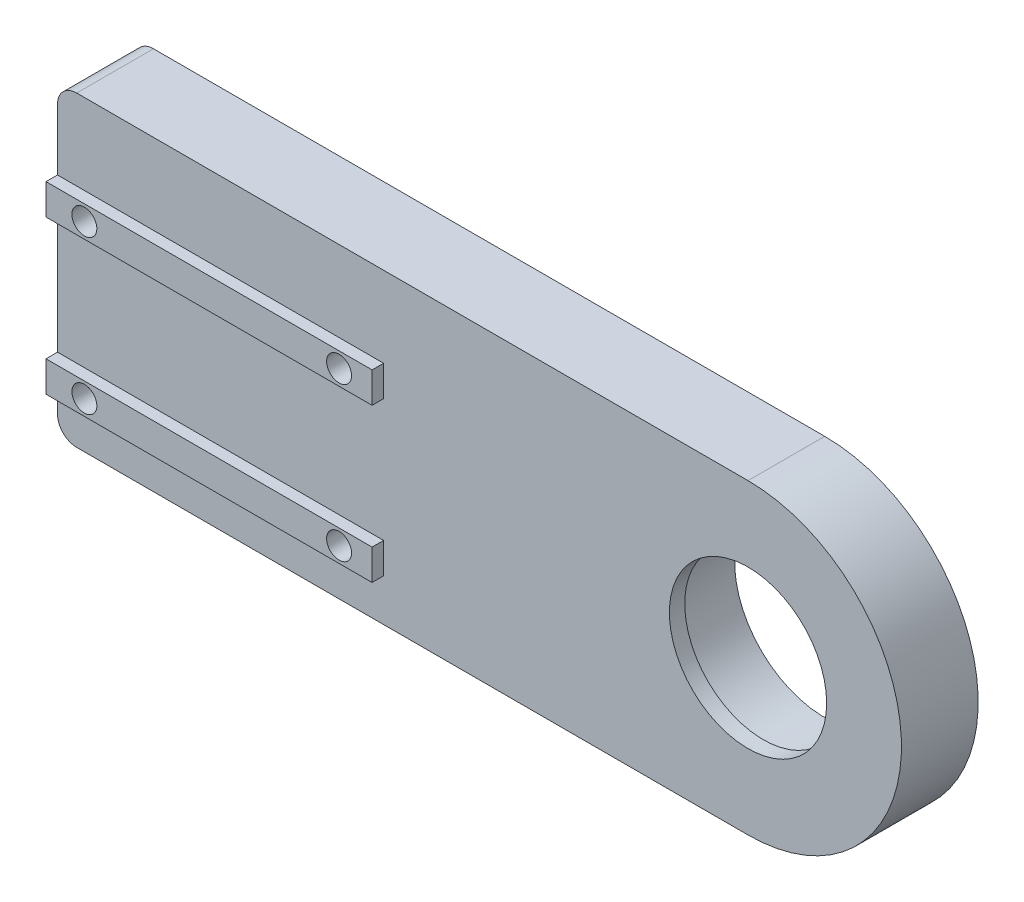
ISO-10303-21;
HEADER;
FILE_DESCRIPTION(('STEP AP214'),'2;1');
FILE_NAME('part.step','',(''),(''),'','','');
FILE_SCHEMA(('AUTOMOTIVE_DESIGN { 1 0 10303 214 1 1 1 1 }'));
ENDSEC;
DATA;
#1=APPLICATION_CONTEXT('core data for automotive mechanical design processes');
#2=APPLICATION_PROTOCOL_DEFINITION('international standard','automotive_design',2000,#1);
#3=PRODUCT_CONTEXT('',#1,'mechanical');
#4=PRODUCT('Part','Part','',(#3));
#5=PRODUCT_RELATED_PRODUCT_CATEGORY('part','',(#4));
#6=PRODUCT_DEFINITION_FORMATION('','',#4);
#7=PRODUCT_DEFINITION_CONTEXT('part definition',#1,'design');
#8=PRODUCT_DEFINITION('design','',#6,#7);
#9=PRODUCT_DEFINITION_SHAPE('','',#8);
#10=(LENGTH_UNIT() NAMED_UNIT(*) SI_UNIT(.MILLI.,.METRE.));
#11=(NAMED_UNIT(*) PLANE_ANGLE_UNIT() SI_UNIT($,.RADIAN.));
#12=(NAMED_UNIT(*) SI_UNIT($,.STERADIAN.) SOLID_ANGLE_UNIT());
#13=UNCERTAINTY_MEASURE_WITH_UNIT(LENGTH_MEASURE(1.E-05),#10,'distance_accuracy_value','');
#14=(GEOMETRIC_REPRESENTATION_CONTEXT(3) GLOBAL_UNCERTAINTY_ASSIGNED_CONTEXT((#13)) GLOBAL_UNIT_ASSIGNED_CONTEXT((#10,
#11,#12)) REPRESENTATION_CONTEXT('',''));
#15=CARTESIAN_POINT('',(0.,0.,0.));
#16=DIRECTION('',(0.,0.,1.));
#17=DIRECTION('',(1.,0.,0.));
#18=AXIS2_PLACEMENT_3D('',#15,#16,#17);
#19=CARTESIAN_POINT('',(-103.6,15.,3.));
#20=DIRECTION('',(0.,0.,-1.));
#21=DIRECTION('',(1.,0.,0.));
#22=AXIS2_PLACEMENT_3D('',#19,#20,#21);
#23=CYLINDRICAL_SURFACE('',#22,3.25000000000001);
#24=CARTESIAN_POINT('',(-103.6,15.,3.));
#25=DIRECTION('',(0.,0.,1.));
#26=DIRECTION('',(1.,0.,0.));
#27=AXIS2_PLACEMENT_3D('',#24,#25,#26);
#28=CIRCLE('',#27,3.25000000000001);
#29=CARTESIAN_POINT('',(-100.35,15.,3.));
#30=VERTEX_POINT('',#29);
#31=EDGE_CURVE('E170',#30,#30,#28,.T.);
#32=ORIENTED_EDGE('',*,*,#31,.T.);
#33=EDGE_LOOP('',(#32));
#34=FACE_BOUND('',#33,.T.);
#35=CARTESIAN_POINT('',(-103.6,15.,-15.5));
#36=DIRECTION('',(0.,0.,1.));
#37=DIRECTION('',(1.,0.,0.));
#38=AXIS2_PLACEMENT_3D('',#35,#36,#37);
#39=CIRCLE('',#38,3.25000000000001);
#40=CARTESIAN_POINT('',(-100.35,15.,-15.5));
#41=VERTEX_POINT('',#40);
#42=EDGE_CURVE('E260',#41,#41,#39,.F.);
#43=ORIENTED_EDGE('',*,*,#42,.T.);
#44=EDGE_LOOP('',(#43));
#45=FACE_BOUND('',#44,.T.);
#46=ADVANCED_FACE('F37',(#34,#45),#23,.F.);
#47=CARTESIAN_POINT('',(-170.,15.,3.));
#48=DIRECTION('',(0.,0.,-1.));
#49=DIRECTION('',(1.,0.,0.));
#50=AXIS2_PLACEMENT_3D('',#47,#48,#49);
#51=CYLINDRICAL_SURFACE('',#50,3.25000000000001);
#52=CARTESIAN_POINT('',(-170.,15.,3.));
#53=DIRECTION('',(0.,0.,1.));
#54=DIRECTION('',(1.,0.,0.));
#55=AXIS2_PLACEMENT_3D('',#52,#53,#54);
#56=CIRCLE('',#55,3.25000000000001);
#57=CARTESIAN_POINT('',(-166.75,15.,3.));
#58=VERTEX_POINT('',#57);
#59=EDGE_CURVE('E432',#58,#58,#56,.T.);
#60=ORIENTED_EDGE('',*,*,#59,.T.);
#61=EDGE_LOOP('',(#60));
#62=FACE_BOUND('',#61,.T.);
#63=CARTESIAN_POINT('',(-170.,15.,-15.5));
#64=DIRECTION('',(0.,0.,1.));
#65=DIRECTION('',(1.,0.,0.));
#66=AXIS2_PLACEMENT_3D('',#63,#64,#65);
#67=CIRCLE('',#66,3.25000000000001);
#68=CARTESIAN_POINT('',(-166.75,15.,-15.5));
#69=VERTEX_POINT('',#68);
#70=EDGE_CURVE('E257',#69,#69,#67,.F.);
#71=ORIENTED_EDGE('',*,*,#70,.T.);
#72=EDGE_LOOP('',(#71));
#73=FACE_BOUND('',#72,.T.);
#74=ADVANCED_FACE('F306',(#62,#73),#51,.F.);
#75=CARTESIAN_POINT('',(-170.,-25.,3.));
#76=DIRECTION('',(0.,0.,-1.));
#77=DIRECTION('',(1.,0.,0.));
#78=AXIS2_PLACEMENT_3D('',#75,#76,#77);
#79=CYLINDRICAL_SURFACE('',#78,3.25000000000001);
#80=CARTESIAN_POINT('',(-170.,-25.,3.));
#81=DIRECTION('',(0.,0.,1.));
#82=DIRECTION('',(1.,0.,0.));
#83=AXIS2_PLACEMENT_3D('',#80,#81,#82);
#84=CIRCLE('',#83,3.25000000000001);
#85=CARTESIAN_POINT('',(-166.75,-25.,3.));
#86=VERTEX_POINT('',#85);
#87=EDGE_CURVE('E435',#86,#86,#84,.T.);
#88=ORIENTED_EDGE('',*,*,#87,.T.);
#89=EDGE_LOOP('',(#88));
#90=FACE_BOUND('',#89,.T.);
#91=CARTESIAN_POINT('',(-170.,-25.,-15.5));
#92=DIRECTION('',(0.,0.,1.));
#93=DIRECTION('',(1.,0.,0.));
#94=AXIS2_PLACEMENT_3D('',#91,#92,#93);
#95=CIRCLE('',#94,3.25000000000001);
#96=CARTESIAN_POINT('',(-166.75,-25.,-15.5));
#97=VERTEX_POINT('',#96);
#98=EDGE_CURVE('E253',#97,#97,#95,.F.);
#99=ORIENTED_EDGE('',*,*,#98,.T.);
#100=EDGE_LOOP('',(#99));
#101=FACE_BOUND('',#100,.T.);
#102=ADVANCED_FACE('F312',(#90,#101),#79,.F.);
#103=CARTESIAN_POINT('',(-103.6,-25.,3.));
#104=DIRECTION('',(0.,0.,-1.));
#105=DIRECTION('',(1.,0.,0.));
#106=AXIS2_PLACEMENT_3D('',#103,#104,#105);
#107=CYLINDRICAL_SURFACE('',#106,3.25000000000001);
#108=CARTESIAN_POINT('',(-103.6,-25.,3.));
#109=DIRECTION('',(0.,0.,1.));
#110=DIRECTION('',(1.,0.,0.));
#111=AXIS2_PLACEMENT_3D('',#108,#109,#110);
#112=CIRCLE('',#111,3.25000000000001);
#113=CARTESIAN_POINT('',(-100.35,-25.,3.));
#114=VERTEX_POINT('',#113);
#115=EDGE_CURVE('E263',#114,#114,#112,.T.);
#116=ORIENTED_EDGE('',*,*,#115,.T.);
#117=EDGE_LOOP('',(#116));
#118=FACE_BOUND('',#117,.T.);
#119=CARTESIAN_POINT('',(-103.6,-25.,-15.5));
#120=DIRECTION('',(0.,0.,1.));
#121=DIRECTION('',(1.,0.,0.));
#122=AXIS2_PLACEMENT_3D('',#119,#120,#121);
#123=CIRCLE('',#122,3.25000000000001);
#124=CARTESIAN_POINT('',(-100.35,-25.,-15.5));
#125=VERTEX_POINT('',#124);
#126=EDGE_CURVE('E250',#125,#125,#123,.F.);
#127=ORIENTED_EDGE('',*,*,#126,.T.);
#128=EDGE_LOOP('',(#127));
#129=FACE_BOUND('',#128,.T.);
#130=ADVANCED_FACE('F319',(#118,#129),#107,.F.);
#131=CARTESIAN_POINT('',(0.,0.,0.));
#132=DIRECTION('',(0.,0.,-1.));
#133=DIRECTION('',(1.,0.,0.));
#134=AXIS2_PLACEMENT_3D('',#131,#132,#133);
#135=PLANE('',#134);
#136=CARTESIAN_POINT('',(0.,0.,0.));
#137=DIRECTION('',(0.,0.,1.));
#138=DIRECTION('',(1.,0.,0.));
#139=AXIS2_PLACEMENT_3D('',#136,#137,#138);
#140=CIRCLE('',#139,20.5);
#141=CARTESIAN_POINT('',(20.5,0.,0.));
#142=VERTEX_POINT('',#141);
#143=EDGE_CURVE('E217',#142,#142,#140,.T.);
#144=ORIENTED_EDGE('',*,*,#143,.F.);
#145=EDGE_LOOP('',(#144));
#146=FACE_BOUND('',#145,.T.);
#147=DIRECTION('',(0.,-1.,0.));
#148=VECTOR('',#147,1.);
#149=CARTESIAN_POINT('',(-180.,40.,0.));
#150=LINE('',#149,#148);
#151=CARTESIAN_POINT('',(-180.,35.,0.));
#152=VERTEX_POINT('',#151);
#153=CARTESIAN_POINT('',(-180.,19.,0.));
#154=VERTEX_POINT('',#153);
#155=EDGE_CURVE('E239',#152,#154,#150,.T.);
#156=ORIENTED_EDGE('',*,*,#155,.T.);
#157=DIRECTION('',(1.,0.,0.));
#158=VECTOR('',#157,1.);
#159=CARTESIAN_POINT('',(-180.,19.,0.));
#160=LINE('',#159,#158);
#161=CARTESIAN_POINT('',(-95.,19.,0.));
#162=VERTEX_POINT('',#161);
#163=EDGE_CURVE('E153',#154,#162,#160,.T.);
#164=ORIENTED_EDGE('',*,*,#163,.T.);
#165=DIRECTION('',(0.,-1.,0.));
#166=VECTOR('',#165,1.);
#167=CARTESIAN_POINT('',(-95.,11.,0.));
#168=LINE('',#167,#166);
#169=CARTESIAN_POINT('',(-95.,11.,0.));
#170=VERTEX_POINT('',#169);
#171=EDGE_CURVE('E167',#162,#170,#168,.T.);
#172=ORIENTED_EDGE('',*,*,#171,.T.);
#173=DIRECTION('',(-1.,0.,0.));
#174=VECTOR('',#173,1.);
#175=CARTESIAN_POINT('',(-180.,11.,0.));
#176=LINE('',#175,#174);
#177=CARTESIAN_POINT('',(-180.,11.,0.));
#178=VERTEX_POINT('',#177);
#179=EDGE_CURVE('E164',#170,#178,#176,.T.);
#180=ORIENTED_EDGE('',*,*,#179,.T.);
#181=CARTESIAN_POINT('',(-180.,-21.,0.));
#182=VERTEX_POINT('',#181);
#183=EDGE_CURVE('E241',#178,#182,#150,.T.);
#184=ORIENTED_EDGE('',*,*,#183,.T.);
#185=DIRECTION('',(1.,0.,0.));
#186=VECTOR('',#185,1.);
#187=CARTESIAN_POINT('',(-180.,-21.,0.));
#188=LINE('',#187,#186);
#189=CARTESIAN_POINT('',(-95.,-21.,0.));
#190=VERTEX_POINT('',#189);
#191=EDGE_CURVE('E157',#182,#190,#188,.T.);
#192=ORIENTED_EDGE('',*,*,#191,.T.);
#193=DIRECTION('',(0.,-1.,0.));
#194=VECTOR('',#193,1.);
#195=CARTESIAN_POINT('',(-95.,-29.,0.));
#196=LINE('',#195,#194);
#197=CARTESIAN_POINT('',(-95.,-29.,0.));
#198=VERTEX_POINT('',#197);
#199=EDGE_CURVE('E198',#190,#198,#196,.T.);
#200=ORIENTED_EDGE('',*,*,#199,.T.);
#201=DIRECTION('',(-1.,0.,0.));
#202=VECTOR('',#201,1.);
#203=CARTESIAN_POINT('',(-180.,-29.,0.));
#204=LINE('',#203,#202);
#205=CARTESIAN_POINT('',(-180.,-29.,0.));
#206=VERTEX_POINT('',#205);
#207=EDGE_CURVE('E187',#198,#206,#204,.T.);
#208=ORIENTED_EDGE('',*,*,#207,.T.);
#209=CARTESIAN_POINT('',(-180.,-35.,0.));
#210=VERTEX_POINT('',#209);
#211=EDGE_CURVE('E238',#206,#210,#150,.T.);
#212=ORIENTED_EDGE('',*,*,#211,.T.);
#213=CARTESIAN_POINT('',(-175.,-35.,0.));
#214=DIRECTION('',(0.,0.,1.));
#215=DIRECTION('',(1.,0.,0.));
#216=AXIS2_PLACEMENT_3D('',#213,#214,#215);
#217=CIRCLE('',#216,5.);
#218=CARTESIAN_POINT('',(-175.,-40.,0.));
#219=VERTEX_POINT('',#218);
#220=EDGE_CURVE('E267',#219,#210,#217,.F.);
#221=ORIENTED_EDGE('',*,*,#220,.F.);
#222=DIRECTION('',(1.,0.,0.));
#223=VECTOR('',#222,1.);
#224=CARTESIAN_POINT('',(-180.,-40.,0.));
#225=LINE('',#224,#223);
#226=CARTESIAN_POINT('',(0.,-40.,0.));
#227=VERTEX_POINT('',#226);
#228=EDGE_CURVE('E225',#219,#227,#225,.T.);
#229=ORIENTED_EDGE('',*,*,#228,.T.);
#230=CARTESIAN_POINT('',(0.,0.,0.));
#231=DIRECTION('',(0.,0.,1.));
#232=DIRECTION('',(1.,0.,0.));
#233=AXIS2_PLACEMENT_3D('',#230,#231,#232);
#234=CIRCLE('',#233,40.);
#235=CARTESIAN_POINT('',(0.,40.,0.));
#236=VERTEX_POINT('',#235);
#237=EDGE_CURVE('E220',#227,#236,#234,.T.);
#238=ORIENTED_EDGE('',*,*,#237,.T.);
#239=DIRECTION('',(-1.,0.,0.));
#240=VECTOR('',#239,1.);
#241=CARTESIAN_POINT('',(0.,40.,0.));
#242=LINE('',#241,#240);
#243=CARTESIAN_POINT('',(-175.,40.,0.));
#244=VERTEX_POINT('',#243);
#245=EDGE_CURVE('E235',#236,#244,#242,.T.);
#246=ORIENTED_EDGE('',*,*,#245,.T.);
#247=CARTESIAN_POINT('',(-175.,35.,0.));
#248=DIRECTION('',(0.,0.,1.));
#249=DIRECTION('',(1.,0.,0.));
#250=AXIS2_PLACEMENT_3D('',#247,#248,#249);
#251=CIRCLE('',#250,5.);
#252=EDGE_CURVE('E270',#152,#244,#251,.F.);
#253=ORIENTED_EDGE('',*,*,#252,.F.);
#254=EDGE_LOOP('',(#156,#164,#172,#180,#184,#192,#200,#208,#212,#221,#229,#238,#246,#253));
#255=FACE_BOUND('',#254,.T.);
#256=ADVANCED_FACE('F284',(#146,#255),#135,.F.);
#257=CARTESIAN_POINT('',(0.,0.,-20.));
#258=DIRECTION('',(0.,0.,1.));
#259=DIRECTION('',(-1.,0.,0.));
#260=AXIS2_PLACEMENT_3D('',#257,#258,#259);
#261=CYLINDRICAL_SURFACE('',#260,20.5);
#262=ORIENTED_EDGE('',*,*,#143,.T.);
#263=EDGE_LOOP('',(#262));
#264=FACE_BOUND('',#263,.T.);
#265=CARTESIAN_POINT('',(0.,0.,-4.));
#266=DIRECTION('',(0.,0.,1.));
#267=DIRECTION('',(1.,0.,0.));
#268=AXIS2_PLACEMENT_3D('',#265,#266,#267);
#269=CIRCLE('',#268,20.5);
#270=CARTESIAN_POINT('',(20.5,0.,-4.));
#271=VERTEX_POINT('',#270);
#272=EDGE_CURVE('E214',#271,#271,#269,.T.);
#273=ORIENTED_EDGE('',*,*,#272,.F.);
#274=EDGE_LOOP('',(#273));
#275=FACE_BOUND('',#274,.T.);
#276=ADVANCED_FACE('F354',(#264,#275),#261,.F.);
#277=CARTESIAN_POINT('',(0.,0.,-20.));
#278=DIRECTION('',(0.,0.,-1.));
#279=DIRECTION('',(1.,0.,0.));
#280=AXIS2_PLACEMENT_3D('',#277,#278,#279);
#281=PLANE('',#280);
#282=CARTESIAN_POINT('',(-170.,-25.,-20.));
#283=DIRECTION('',(0.,0.,1.));
#284=DIRECTION('',(1.,0.,0.));
#285=AXIS2_PLACEMENT_3D('',#282,#283,#284);
#286=CIRCLE('',#285,5.50000000000002);
#287=CARTESIAN_POINT('',(-164.5,-25.,-20.));
#288=VERTEX_POINT('',#287);
#289=EDGE_CURVE('E659',#288,#288,#286,.T.);
#290=ORIENTED_EDGE('',*,*,#289,.T.);
#291=EDGE_LOOP('',(#290));
#292=FACE_BOUND('',#291,.T.);
#293=CARTESIAN_POINT('',(-103.6,-25.,-20.));
#294=DIRECTION('',(0.,0.,1.));
#295=DIRECTION('',(1.,0.,0.));
#296=AXIS2_PLACEMENT_3D('',#293,#294,#295);
#297=CIRCLE('',#296,5.49999999999999);
#298=CARTESIAN_POINT('',(-98.1,-25.,-20.));
#299=VERTEX_POINT('',#298);
#300=EDGE_CURVE('E652',#299,#299,#297,.T.);
#301=ORIENTED_EDGE('',*,*,#300,.T.);
#302=EDGE_LOOP('',(#301));
#303=FACE_BOUND('',#302,.T.);
#304=CARTESIAN_POINT('',(-103.6,15.,-20.));
#305=DIRECTION('',(0.,0.,1.));
#306=DIRECTION('',(1.,0.,0.));
#307=AXIS2_PLACEMENT_3D('',#304,#305,#306);
#308=CIRCLE('',#307,5.49999999999999);
#309=CARTESIAN_POINT('',(-98.1,15.,-20.));
#310=VERTEX_POINT('',#309);
#311=EDGE_CURVE('E428',#310,#310,#308,.T.);
#312=ORIENTED_EDGE('',*,*,#311,.T.);
#313=EDGE_LOOP('',(#312));
#314=FACE_BOUND('',#313,.T.);
#315=CARTESIAN_POINT('',(-170.,15.,-20.));
#316=DIRECTION('',(0.,0.,1.));
#317=DIRECTION('',(1.,0.,0.));
#318=AXIS2_PLACEMENT_3D('',#315,#316,#317);
#319=CIRCLE('',#318,5.50000000000002);
#320=CARTESIAN_POINT('',(-164.5,15.,-20.));
#321=VERTEX_POINT('',#320);
#322=EDGE_CURVE('E422',#321,#321,#319,.T.);
#323=ORIENTED_EDGE('',*,*,#322,.T.);
#324=EDGE_LOOP('',(#323));
#325=FACE_BOUND('',#324,.T.);
#326=CARTESIAN_POINT('',(0.,0.,-20.));
#327=DIRECTION('',(0.,0.,1.));
#328=DIRECTION('',(1.,0.,0.));
#329=AXIS2_PLACEMENT_3D('',#326,#327,#328);
#330=CIRCLE('',#329,23.5);
#331=CARTESIAN_POINT('',(23.5,0.,-20.));
#332=VERTEX_POINT('',#331);
#333=EDGE_CURVE('E210',#332,#332,#330,.T.);
#334=ORIENTED_EDGE('',*,*,#333,.T.);
#335=EDGE_LOOP('',(#334));
#336=FACE_BOUND('',#335,.T.);
#337=DIRECTION('',(-1.,0.,0.));
#338=VECTOR('',#337,1.);
#339=CARTESIAN_POINT('',(0.,40.,-20.));
#340=LINE('',#339,#338);
#341=CARTESIAN_POINT('',(0.,40.,-20.));
#342=VERTEX_POINT('',#341);
#343=CARTESIAN_POINT('',(-175.,40.,-20.));
#344=VERTEX_POINT('',#343);
#345=EDGE_CURVE('E224',#342,#344,#340,.T.);
#346=ORIENTED_EDGE('',*,*,#345,.F.);
#347=CARTESIAN_POINT('',(0.,0.,-20.));
#348=DIRECTION('',(0.,0.,1.));
#349=DIRECTION('',(1.,0.,0.));
#350=AXIS2_PLACEMENT_3D('',#347,#348,#349);
#351=CIRCLE('',#350,40.);
#352=CARTESIAN_POINT('',(0.,-40.,-20.));
#353=VERTEX_POINT('',#352);
#354=EDGE_CURVE('E221',#353,#342,#351,.T.);
#355=ORIENTED_EDGE('',*,*,#354,.F.);
#356=DIRECTION('',(1.,0.,0.));
#357=VECTOR('',#356,1.);
#358=CARTESIAN_POINT('',(-180.,-40.,-20.));
#359=LINE('',#358,#357);
#360=CARTESIAN_POINT('',(-175.,-40.,-20.));
#361=VERTEX_POINT('',#360);
#362=EDGE_CURVE('E230',#361,#353,#359,.T.);
#363=ORIENTED_EDGE('',*,*,#362,.F.);
#364=CARTESIAN_POINT('',(-175.,-35.,-20.));
#365=DIRECTION('',(0.,0.,1.));
#366=DIRECTION('',(1.,0.,0.));
#367=AXIS2_PLACEMENT_3D('',#364,#365,#366);
#368=CIRCLE('',#367,5.);
#369=CARTESIAN_POINT('',(-180.,-35.,-20.));
#370=VERTEX_POINT('',#369);
#371=EDGE_CURVE('E273',#370,#361,#368,.T.);
#372=ORIENTED_EDGE('',*,*,#371,.F.);
#373=DIRECTION('',(0.,-1.,0.));
#374=VECTOR('',#373,1.);
#375=CARTESIAN_POINT('',(-180.,40.,-20.));
#376=LINE('',#375,#374);
#377=CARTESIAN_POINT('',(-180.,35.,-20.));
#378=VERTEX_POINT('',#377);
#379=EDGE_CURVE('E228',#378,#370,#376,.T.);
#380=ORIENTED_EDGE('',*,*,#379,.F.);
#381=CARTESIAN_POINT('',(-175.,35.,-20.));
#382=DIRECTION('',(0.,0.,1.));
#383=DIRECTION('',(1.,0.,0.));
#384=AXIS2_PLACEMENT_3D('',#381,#382,#383);
#385=CIRCLE('',#384,5.);
#386=EDGE_CURVE('E45',#344,#378,#385,.T.);
#387=ORIENTED_EDGE('',*,*,#386,.F.);
#388=EDGE_LOOP('',(#346,#355,#363,#372,#380,#387));
#389=FACE_BOUND('',#388,.T.);
#390=ADVANCED_FACE('F280',(#292,#303,#314,#325,#336,#389),#281,.T.);
#391=CARTESIAN_POINT('',(0.,0.,-20.));
#392=DIRECTION('',(0.,0.,1.));
#393=DIRECTION('',(-1.,0.,0.));
#394=AXIS2_PLACEMENT_3D('',#391,#392,#393);
#395=CYLINDRICAL_SURFACE('',#394,40.);
#396=ORIENTED_EDGE('',*,*,#237,.F.);
#397=DIRECTION('',(0.,0.,1.));
#398=VECTOR('',#397,1.);
#399=CARTESIAN_POINT('',(0.,-40.,-20.));
#400=LINE('',#399,#398);
#401=EDGE_CURVE('E232',#353,#227,#400,.T.);
#402=ORIENTED_EDGE('',*,*,#401,.F.);
#403=ORIENTED_EDGE('',*,*,#354,.T.);
#404=DIRECTION('',(0.,0.,1.));
#405=VECTOR('',#404,1.);
#406=CARTESIAN_POINT('',(0.,40.,-20.));
#407=LINE('',#406,#405);
#408=EDGE_CURVE('E245',#342,#236,#407,.T.);
#409=ORIENTED_EDGE('',*,*,#408,.T.);
#410=EDGE_LOOP('',(#396,#402,#403,#409));
#411=FACE_BOUND('',#410,.T.);
#412=ADVANCED_FACE('F291',(#411),#395,.T.);
#413=CARTESIAN_POINT('',(0.,40.,-20.));
#414=DIRECTION('',(0.,-1.,0.));
#415=DIRECTION('',(0.,0.,1.));
#416=AXIS2_PLACEMENT_3D('',#413,#414,#415);
#417=PLANE('',#416);
#418=ORIENTED_EDGE('',*,*,#245,.F.);
#419=ORIENTED_EDGE('',*,*,#408,.F.);
#420=ORIENTED_EDGE('',*,*,#345,.T.);
#421=DIRECTION('',(0.,0.,1.));
#422=VECTOR('',#421,1.);
#423=CARTESIAN_POINT('',(-175.,40.,-20.));
#424=LINE('',#423,#422);
#425=EDGE_CURVE('E58',#244,#344,#424,.F.);
#426=ORIENTED_EDGE('',*,*,#425,.F.);
#427=EDGE_LOOP('',(#418,#419,#420,#426));
#428=FACE_BOUND('',#427,.T.);
#429=ADVANCED_FACE('F288',(#428),#417,.F.);
#430=CARTESIAN_POINT('',(-180.,40.,-20.));
#431=DIRECTION('',(1.,0.,0.));
#432=DIRECTION('',(0.,0.,1.));
#433=AXIS2_PLACEMENT_3D('',#430,#431,#432);
#434=PLANE('',#433);
#435=ORIENTED_EDGE('',*,*,#379,.T.);
#436=DIRECTION('',(0.,0.,1.));
#437=VECTOR('',#436,1.);
#438=CARTESIAN_POINT('',(-180.,-35.,-20.));
#439=LINE('',#438,#437);
#440=EDGE_CURVE('E247',#210,#370,#439,.F.);
#441=ORIENTED_EDGE('',*,*,#440,.F.);
#442=ORIENTED_EDGE('',*,*,#211,.F.);
#443=DIRECTION('',(0.,0.,-1.));
#444=VECTOR('',#443,1.);
#445=CARTESIAN_POINT('',(-180.,-29.,3.));
#446=LINE('',#445,#444);
#447=CARTESIAN_POINT('',(-180.,-29.,3.));
#448=VERTEX_POINT('',#447);
#449=EDGE_CURVE('E195',#448,#206,#446,.T.);
#450=ORIENTED_EDGE('',*,*,#449,.F.);
#451=DIRECTION('',(0.,1.,0.));
#452=VECTOR('',#451,1.);
#453=CARTESIAN_POINT('',(-180.,-29.,3.));
#454=LINE('',#453,#452);
#455=CARTESIAN_POINT('',(-180.,-21.,3.));
#456=VERTEX_POINT('',#455);
#457=EDGE_CURVE('E183',#448,#456,#454,.T.);
#458=ORIENTED_EDGE('',*,*,#457,.T.);
#459=DIRECTION('',(0.,0.,-1.));
#460=VECTOR('',#459,1.);
#461=CARTESIAN_POINT('',(-180.,-21.,3.));
#462=LINE('',#461,#460);
#463=EDGE_CURVE('E208',#456,#182,#462,.T.);
#464=ORIENTED_EDGE('',*,*,#463,.T.);
#465=ORIENTED_EDGE('',*,*,#183,.F.);
#466=DIRECTION('',(0.,0.,-1.));
#467=VECTOR('',#466,1.);
#468=CARTESIAN_POINT('',(-180.,11.,3.));
#469=LINE('',#468,#467);
#470=CARTESIAN_POINT('',(-180.,11.,3.));
#471=VERTEX_POINT('',#470);
#472=EDGE_CURVE('E163',#471,#178,#469,.T.);
#473=ORIENTED_EDGE('',*,*,#472,.F.);
#474=DIRECTION('',(0.,1.,0.));
#475=VECTOR('',#474,1.);
#476=CARTESIAN_POINT('',(-180.,11.,3.));
#477=LINE('',#476,#475);
#478=CARTESIAN_POINT('',(-180.,19.,3.));
#479=VERTEX_POINT('',#478);
#480=EDGE_CURVE('E142',#471,#479,#477,.T.);
#481=ORIENTED_EDGE('',*,*,#480,.T.);
#482=DIRECTION('',(0.,0.,-1.));
#483=VECTOR('',#482,1.);
#484=CARTESIAN_POINT('',(-180.,19.,3.));
#485=LINE('',#484,#483);
#486=EDGE_CURVE('E150',#479,#154,#485,.T.);
#487=ORIENTED_EDGE('',*,*,#486,.T.);
#488=ORIENTED_EDGE('',*,*,#155,.F.);
#489=DIRECTION('',(0.,0.,1.));
#490=VECTOR('',#489,1.);
#491=CARTESIAN_POINT('',(-180.,35.,-20.));
#492=LINE('',#491,#490);
#493=EDGE_CURVE('E265',#378,#152,#492,.T.);
#494=ORIENTED_EDGE('',*,*,#493,.F.);
#495=EDGE_LOOP('',(#435,#441,#442,#450,#458,#464,#465,#473,#481,#487,#488,#494));
#496=FACE_BOUND('',#495,.T.);
#497=ADVANCED_FACE('F161',(#496),#434,.F.);
#498=CARTESIAN_POINT('',(-180.,-40.,-20.));
#499=DIRECTION('',(0.,1.,0.));
#500=DIRECTION('',(0.,0.,-1.));
#501=AXIS2_PLACEMENT_3D('',#498,#499,#500);
#502=PLANE('',#501);
#503=ORIENTED_EDGE('',*,*,#362,.T.);
#504=ORIENTED_EDGE('',*,*,#401,.T.);
#505=ORIENTED_EDGE('',*,*,#228,.F.);
#506=DIRECTION('',(0.,0.,1.));
#507=VECTOR('',#506,1.);
#508=CARTESIAN_POINT('',(-175.,-40.,-20.));
#509=LINE('',#508,#507);
#510=EDGE_CURVE('E11',#361,#219,#509,.T.);
#511=ORIENTED_EDGE('',*,*,#510,.F.);
#512=EDGE_LOOP('',(#503,#504,#505,#511));
#513=FACE_BOUND('',#512,.T.);
#514=ADVANCED_FACE('F292',(#513),#502,.F.);
#515=CARTESIAN_POINT('',(0.,0.,-4.));
#516=DIRECTION('',(0.,0.,-1.));
#517=DIRECTION('',(1.,0.,0.));
#518=AXIS2_PLACEMENT_3D('',#515,#516,#517);
#519=CYLINDRICAL_SURFACE('',#518,23.5);
#520=CARTESIAN_POINT('',(0.,0.,-4.));
#521=DIRECTION('',(0.,0.,1.));
#522=DIRECTION('',(1.,0.,0.));
#523=AXIS2_PLACEMENT_3D('',#520,#521,#522);
#524=CIRCLE('',#523,23.5);
#525=CARTESIAN_POINT('',(23.5,0.,-4.));
#526=VERTEX_POINT('',#525);
#527=EDGE_CURVE('E211',#526,#526,#524,.T.);
#528=ORIENTED_EDGE('',*,*,#527,.T.);
#529=EDGE_LOOP('',(#528));
#530=FACE_BOUND('',#529,.T.);
#531=ORIENTED_EDGE('',*,*,#333,.F.);
#532=EDGE_LOOP('',(#531));
#533=FACE_BOUND('',#532,.T.);
#534=ADVANCED_FACE('F294',(#530,#533),#519,.F.);
#535=CARTESIAN_POINT('',(0.,0.,-4.));
#536=DIRECTION('',(0.,0.,-1.));
#537=DIRECTION('',(1.,0.,0.));
#538=AXIS2_PLACEMENT_3D('',#535,#536,#537);
#539=PLANE('',#538);
#540=ORIENTED_EDGE('',*,*,#272,.T.);
#541=EDGE_LOOP('',(#540));
#542=FACE_BOUND('',#541,.T.);
#543=ORIENTED_EDGE('',*,*,#527,.F.);
#544=EDGE_LOOP('',(#543));
#545=FACE_BOUND('',#544,.T.);
#546=ADVANCED_FACE('F300',(#542,#545),#539,.T.);
#547=CARTESIAN_POINT('',(-180.,-21.,3.));
#548=DIRECTION('',(0.,-1.,0.));
#549=DIRECTION('',(0.,0.,1.));
#550=AXIS2_PLACEMENT_3D('',#547,#548,#549);
#551=PLANE('',#550);
#552=ORIENTED_EDGE('',*,*,#191,.F.);
#553=ORIENTED_EDGE('',*,*,#463,.F.);
#554=DIRECTION('',(1.,0.,0.));
#555=VECTOR('',#554,1.);
#556=CARTESIAN_POINT('',(-180.,-21.,3.));
#557=LINE('',#556,#555);
#558=CARTESIAN_POINT('',(-95.,-21.,3.));
#559=VERTEX_POINT('',#558);
#560=EDGE_CURVE('E186',#456,#559,#557,.T.);
#561=ORIENTED_EDGE('',*,*,#560,.T.);
#562=DIRECTION('',(0.,0.,-1.));
#563=VECTOR('',#562,1.);
#564=CARTESIAN_POINT('',(-95.,-21.,3.));
#565=LINE('',#564,#563);
#566=EDGE_CURVE('E206',#559,#190,#565,.T.);
#567=ORIENTED_EDGE('',*,*,#566,.T.);
#568=EDGE_LOOP('',(#552,#553,#561,#567));
#569=FACE_BOUND('',#568,.T.);
#570=ADVANCED_FACE('F346',(#569),#551,.F.);
#571=CARTESIAN_POINT('',(-95.,-29.,3.));
#572=DIRECTION('',(-1.,0.,0.));
#573=DIRECTION('',(0.,0.,-1.));
#574=AXIS2_PLACEMENT_3D('',#571,#572,#573);
#575=PLANE('',#574);
#576=ORIENTED_EDGE('',*,*,#199,.F.);
#577=ORIENTED_EDGE('',*,*,#566,.F.);
#578=DIRECTION('',(0.,-1.,0.));
#579=VECTOR('',#578,1.);
#580=CARTESIAN_POINT('',(-95.,-29.,3.));
#581=LINE('',#580,#579);
#582=CARTESIAN_POINT('',(-95.,-29.,3.));
#583=VERTEX_POINT('',#582);
#584=EDGE_CURVE('E190',#559,#583,#581,.T.);
#585=ORIENTED_EDGE('',*,*,#584,.T.);
#586=DIRECTION('',(0.,0.,-1.));
#587=VECTOR('',#586,1.);
#588=CARTESIAN_POINT('',(-95.,-29.,3.));
#589=LINE('',#588,#587);
#590=EDGE_CURVE('E204',#583,#198,#589,.T.);
#591=ORIENTED_EDGE('',*,*,#590,.T.);
#592=EDGE_LOOP('',(#576,#577,#585,#591));
#593=FACE_BOUND('',#592,.T.);
#594=ADVANCED_FACE('F342',(#593),#575,.F.);
#595=CARTESIAN_POINT('',(-180.,-29.,3.));
#596=DIRECTION('',(0.,1.,0.));
#597=DIRECTION('',(-1.,0.,0.));
#598=AXIS2_PLACEMENT_3D('',#595,#596,#597);
#599=PLANE('',#598);
#600=ORIENTED_EDGE('',*,*,#207,.F.);
#601=ORIENTED_EDGE('',*,*,#590,.F.);
#602=DIRECTION('',(-1.,0.,0.));
#603=VECTOR('',#602,1.);
#604=CARTESIAN_POINT('',(-180.,-29.,3.));
#605=LINE('',#604,#603);
#606=EDGE_CURVE('E193',#583,#448,#605,.T.);
#607=ORIENTED_EDGE('',*,*,#606,.T.);
#608=ORIENTED_EDGE('',*,*,#449,.T.);
#609=EDGE_LOOP('',(#600,#601,#607,#608));
#610=FACE_BOUND('',#609,.T.);
#611=ADVANCED_FACE('F338',(#610),#599,.F.);
#612=CARTESIAN_POINT('',(0.,0.,3.));
#613=DIRECTION('',(0.,0.,1.));
#614=DIRECTION('',(-1.,0.,0.));
#615=AXIS2_PLACEMENT_3D('',#612,#613,#614);
#616=PLANE('',#615);
#617=ORIENTED_EDGE('',*,*,#115,.F.);
#618=EDGE_LOOP('',(#617));
#619=FACE_BOUND('',#618,.T.);
#620=ORIENTED_EDGE('',*,*,#87,.F.);
#621=EDGE_LOOP('',(#620));
#622=FACE_BOUND('',#621,.T.);
#623=ORIENTED_EDGE('',*,*,#457,.F.);
#624=ORIENTED_EDGE('',*,*,#606,.F.);
#625=ORIENTED_EDGE('',*,*,#584,.F.);
#626=ORIENTED_EDGE('',*,*,#560,.F.);
#627=EDGE_LOOP('',(#623,#624,#625,#626));
#628=FACE_BOUND('',#627,.T.);
#629=ADVANCED_FACE('F335',(#619,#622,#628),#616,.T.);
#630=CARTESIAN_POINT('',(-180.,19.,3.));
#631=DIRECTION('',(0.,-1.,0.));
#632=DIRECTION('',(1.,0.,0.));
#633=AXIS2_PLACEMENT_3D('',#630,#631,#632);
#634=PLANE('',#633);
#635=ORIENTED_EDGE('',*,*,#163,.F.);
#636=ORIENTED_EDGE('',*,*,#486,.F.);
#637=DIRECTION('',(1.,0.,0.));
#638=VECTOR('',#637,1.);
#639=CARTESIAN_POINT('',(-180.,19.,3.));
#640=LINE('',#639,#638);
#641=CARTESIAN_POINT('',(-95.,19.,3.));
#642=VERTEX_POINT('',#641);
#643=EDGE_CURVE('E138',#479,#642,#640,.T.);
#644=ORIENTED_EDGE('',*,*,#643,.T.);
#645=DIRECTION('',(0.,0.,-1.));
#646=VECTOR('',#645,1.);
#647=CARTESIAN_POINT('',(-95.,19.,3.));
#648=LINE('',#647,#646);
#649=EDGE_CURVE('E158',#642,#162,#648,.T.);
#650=ORIENTED_EDGE('',*,*,#649,.T.);
#651=EDGE_LOOP('',(#635,#636,#644,#650));
#652=FACE_BOUND('',#651,.T.);
#653=ADVANCED_FACE('F151',(#652),#634,.F.);
#654=CARTESIAN_POINT('',(-95.,11.,3.));
#655=DIRECTION('',(-1.,0.,0.));
#656=DIRECTION('',(0.,0.,-1.));
#657=AXIS2_PLACEMENT_3D('',#654,#655,#656);
#658=PLANE('',#657);
#659=ORIENTED_EDGE('',*,*,#171,.F.);
#660=ORIENTED_EDGE('',*,*,#649,.F.);
#661=DIRECTION('',(0.,-1.,0.));
#662=VECTOR('',#661,1.);
#663=CARTESIAN_POINT('',(-95.,11.,3.));
#664=LINE('',#663,#662);
#665=CARTESIAN_POINT('',(-95.,11.,3.));
#666=VERTEX_POINT('',#665);
#667=EDGE_CURVE('E145',#642,#666,#664,.T.);
#668=ORIENTED_EDGE('',*,*,#667,.T.);
#669=DIRECTION('',(0.,0.,-1.));
#670=VECTOR('',#669,1.);
#671=CARTESIAN_POINT('',(-95.,11.,3.));
#672=LINE('',#671,#670);
#673=EDGE_CURVE('E180',#666,#170,#672,.T.);
#674=ORIENTED_EDGE('',*,*,#673,.T.);
#675=EDGE_LOOP('',(#659,#660,#668,#674));
#676=FACE_BOUND('',#675,.T.);
#677=ADVANCED_FACE('F328',(#676),#658,.F.);
#678=CARTESIAN_POINT('',(-180.,11.,3.));
#679=DIRECTION('',(0.,1.,0.));
#680=DIRECTION('',(-1.,0.,0.));
#681=AXIS2_PLACEMENT_3D('',#678,#679,#680);
#682=PLANE('',#681);
#683=ORIENTED_EDGE('',*,*,#179,.F.);
#684=ORIENTED_EDGE('',*,*,#673,.F.);
#685=DIRECTION('',(-1.,0.,0.));
#686=VECTOR('',#685,1.);
#687=CARTESIAN_POINT('',(-180.,11.,3.));
#688=LINE('',#687,#686);
#689=EDGE_CURVE('E174',#666,#471,#688,.T.);
#690=ORIENTED_EDGE('',*,*,#689,.T.);
#691=ORIENTED_EDGE('',*,*,#472,.T.);
#692=EDGE_LOOP('',(#683,#684,#690,#691));
#693=FACE_BOUND('',#692,.T.);
#694=ADVANCED_FACE('F324',(#693),#682,.F.);
#695=CARTESIAN_POINT('',(0.,0.,3.));
#696=DIRECTION('',(0.,0.,1.));
#697=DIRECTION('',(-1.,0.,0.));
#698=AXIS2_PLACEMENT_3D('',#695,#696,#697);
#699=PLANE('',#698);
#700=ORIENTED_EDGE('',*,*,#59,.F.);
#701=EDGE_LOOP('',(#700));
#702=FACE_BOUND('',#701,.T.);
#703=ORIENTED_EDGE('',*,*,#31,.F.);
#704=EDGE_LOOP('',(#703));
#705=FACE_BOUND('',#704,.T.);
#706=ORIENTED_EDGE('',*,*,#480,.F.);
#707=ORIENTED_EDGE('',*,*,#689,.F.);
#708=ORIENTED_EDGE('',*,*,#667,.F.);
#709=ORIENTED_EDGE('',*,*,#643,.F.);
#710=EDGE_LOOP('',(#706,#707,#708,#709));
#711=FACE_BOUND('',#710,.T.);
#712=ADVANCED_FACE('F140',(#702,#705,#711),#699,.T.);
#713=CARTESIAN_POINT('',(-103.6,-25.,-15.5));
#714=DIRECTION('',(0.,0.,-1.));
#715=DIRECTION('',(1.,0.,0.));
#716=AXIS2_PLACEMENT_3D('',#713,#714,#715);
#717=PLANE('',#716);
#718=CARTESIAN_POINT('',(-103.6,-25.,-15.5));
#719=DIRECTION('',(0.,0.,1.));
#720=DIRECTION('',(1.,0.,0.));
#721=AXIS2_PLACEMENT_3D('',#718,#719,#720);
#722=CIRCLE('',#721,5.49999999999999);
#723=CARTESIAN_POINT('',(-98.1,-25.,-15.5));
#724=VERTEX_POINT('',#723);
#725=EDGE_CURVE('E649',#724,#724,#722,.T.);
#726=ORIENTED_EDGE('',*,*,#725,.F.);
#727=EDGE_LOOP('',(#726));
#728=FACE_BOUND('',#727,.T.);
#729=ORIENTED_EDGE('',*,*,#126,.F.);
#730=EDGE_LOOP('',(#729));
#731=FACE_BOUND('',#730,.T.);
#732=ADVANCED_FACE('F323',(#728,#731),#717,.T.);
#733=CARTESIAN_POINT('',(-103.6,-25.,-15.5));
#734=DIRECTION('',(0.,0.,-1.));
#735=DIRECTION('',(1.,0.,0.));
#736=AXIS2_PLACEMENT_3D('',#733,#734,#735);
#737=CYLINDRICAL_SURFACE('',#736,5.49999999999999);
#738=ORIENTED_EDGE('',*,*,#725,.T.);
#739=EDGE_LOOP('',(#738));
#740=FACE_BOUND('',#739,.T.);
#741=ORIENTED_EDGE('',*,*,#300,.F.);
#742=EDGE_LOOP('',(#741));
#743=FACE_BOUND('',#742,.T.);
#744=ADVANCED_FACE('F384',(#740,#743),#737,.F.);
#745=CARTESIAN_POINT('',(-170.,-25.,-15.5));
#746=DIRECTION('',(0.,0.,-1.));
#747=DIRECTION('',(1.,0.,0.));
#748=AXIS2_PLACEMENT_3D('',#745,#746,#747);
#749=PLANE('',#748);
#750=CARTESIAN_POINT('',(-170.,-25.,-15.5));
#751=DIRECTION('',(0.,0.,1.));
#752=DIRECTION('',(1.,0.,0.));
#753=AXIS2_PLACEMENT_3D('',#750,#751,#752);
#754=CIRCLE('',#753,5.50000000000002);
#755=CARTESIAN_POINT('',(-164.5,-25.,-15.5));
#756=VERTEX_POINT('',#755);
#757=EDGE_CURVE('E657',#756,#756,#754,.T.);
#758=ORIENTED_EDGE('',*,*,#757,.F.);
#759=EDGE_LOOP('',(#758));
#760=FACE_BOUND('',#759,.T.);
#761=ORIENTED_EDGE('',*,*,#98,.F.);
#762=EDGE_LOOP('',(#761));
#763=FACE_BOUND('',#762,.T.);
#764=ADVANCED_FACE('F390',(#760,#763),#749,.T.);
#765=CARTESIAN_POINT('',(-170.,-25.,-15.5));
#766=DIRECTION('',(0.,0.,-1.));
#767=DIRECTION('',(1.,0.,0.));
#768=AXIS2_PLACEMENT_3D('',#765,#766,#767);
#769=CYLINDRICAL_SURFACE('',#768,5.50000000000002);
#770=ORIENTED_EDGE('',*,*,#757,.T.);
#771=EDGE_LOOP('',(#770));
#772=FACE_BOUND('',#771,.T.);
#773=ORIENTED_EDGE('',*,*,#289,.F.);
#774=EDGE_LOOP('',(#773));
#775=FACE_BOUND('',#774,.T.);
#776=ADVANCED_FACE('F400',(#772,#775),#769,.F.);
#777=CARTESIAN_POINT('',(-170.,15.,-15.5));
#778=DIRECTION('',(0.,0.,-1.));
#779=DIRECTION('',(1.,0.,0.));
#780=AXIS2_PLACEMENT_3D('',#777,#778,#779);
#781=PLANE('',#780);
#782=CARTESIAN_POINT('',(-170.,15.,-15.5));
#783=DIRECTION('',(0.,0.,1.));
#784=DIRECTION('',(1.,0.,0.));
#785=AXIS2_PLACEMENT_3D('',#782,#783,#784);
#786=CIRCLE('',#785,5.50000000000002);
#787=CARTESIAN_POINT('',(-164.5,15.,-15.5));
#788=VERTEX_POINT('',#787);
#789=EDGE_CURVE('E254',#788,#788,#786,.T.);
#790=ORIENTED_EDGE('',*,*,#789,.F.);
#791=EDGE_LOOP('',(#790));
#792=FACE_BOUND('',#791,.T.);
#793=ORIENTED_EDGE('',*,*,#70,.F.);
#794=EDGE_LOOP('',(#793));
#795=FACE_BOUND('',#794,.T.);
#796=ADVANCED_FACE('F404',(#792,#795),#781,.T.);
#797=CARTESIAN_POINT('',(-170.,15.,-15.5));
#798=DIRECTION('',(0.,0.,-1.));
#799=DIRECTION('',(1.,0.,0.));
#800=AXIS2_PLACEMENT_3D('',#797,#798,#799);
#801=CYLINDRICAL_SURFACE('',#800,5.50000000000002);
#802=ORIENTED_EDGE('',*,*,#789,.T.);
#803=EDGE_LOOP('',(#802));
#804=FACE_BOUND('',#803,.T.);
#805=ORIENTED_EDGE('',*,*,#322,.F.);
#806=EDGE_LOOP('',(#805));
#807=FACE_BOUND('',#806,.T.);
#808=ADVANCED_FACE('F408',(#804,#807),#801,.F.);
#809=CARTESIAN_POINT('',(-103.6,15.,-15.5));
#810=DIRECTION('',(0.,0.,-1.));
#811=DIRECTION('',(1.,0.,0.));
#812=AXIS2_PLACEMENT_3D('',#809,#810,#811);
#813=PLANE('',#812);
#814=CARTESIAN_POINT('',(-103.6,15.,-15.5));
#815=DIRECTION('',(0.,0.,1.));
#816=DIRECTION('',(1.,0.,0.));
#817=AXIS2_PLACEMENT_3D('',#814,#815,#816);
#818=CIRCLE('',#817,5.49999999999999);
#819=CARTESIAN_POINT('',(-98.1,15.,-15.5));
#820=VERTEX_POINT('',#819);
#821=EDGE_CURVE('E424',#820,#820,#818,.T.);
#822=ORIENTED_EDGE('',*,*,#821,.F.);
#823=EDGE_LOOP('',(#822));
#824=FACE_BOUND('',#823,.T.);
#825=ORIENTED_EDGE('',*,*,#42,.F.);
#826=EDGE_LOOP('',(#825));
#827=FACE_BOUND('',#826,.T.);
#828=ADVANCED_FACE('F411',(#824,#827),#813,.T.);
#829=CARTESIAN_POINT('',(-103.6,15.,-15.5));
#830=DIRECTION('',(0.,0.,-1.));
#831=DIRECTION('',(1.,0.,0.));
#832=AXIS2_PLACEMENT_3D('',#829,#830,#831);
#833=CYLINDRICAL_SURFACE('',#832,5.49999999999999);
#834=ORIENTED_EDGE('',*,*,#821,.T.);
#835=EDGE_LOOP('',(#834));
#836=FACE_BOUND('',#835,.T.);
#837=ORIENTED_EDGE('',*,*,#311,.F.);
#838=EDGE_LOOP('',(#837));
#839=FACE_BOUND('',#838,.T.);
#840=ADVANCED_FACE('F395',(#836,#839),#833,.F.);
#841=CARTESIAN_POINT('',(-175.,35.,-20.));
#842=DIRECTION('',(0.,0.,1.));
#843=DIRECTION('',(-1.,0.,0.));
#844=AXIS2_PLACEMENT_3D('',#841,#842,#843);
#845=CYLINDRICAL_SURFACE('',#844,5.);
#846=ORIENTED_EDGE('',*,*,#386,.T.);
#847=ORIENTED_EDGE('',*,*,#493,.T.);
#848=ORIENTED_EDGE('',*,*,#252,.T.);
#849=ORIENTED_EDGE('',*,*,#425,.T.);
#850=EDGE_LOOP('',(#846,#847,#848,#849));
#851=FACE_BOUND('',#850,.T.);
#852=ADVANCED_FACE('F275',(#851),#845,.T.);
#853=CARTESIAN_POINT('',(-175.,-35.,-20.));
#854=DIRECTION('',(0.,0.,1.));
#855=DIRECTION('',(-1.,0.,0.));
#856=AXIS2_PLACEMENT_3D('',#853,#854,#855);
#857=CYLINDRICAL_SURFACE('',#856,5.);
#858=ORIENTED_EDGE('',*,*,#371,.T.);
#859=ORIENTED_EDGE('',*,*,#510,.T.);
#860=ORIENTED_EDGE('',*,*,#220,.T.);
#861=ORIENTED_EDGE('',*,*,#440,.T.);
#862=EDGE_LOOP('',(#858,#859,#860,#861));
#863=FACE_BOUND('',#862,.T.);
#864=ADVANCED_FACE('F39',(#863),#857,.T.);
#865=CLOSED_SHELL('',(#46,#74,#102,#130,#256,#276,#390,#412,#429,#497,#514,#534,#546,#570,#594,
#611,#629,#653,#677,#694,#712,#732,#744,#764,#776,#796,#808,#828,#840,#852,#864));
#866=MANIFOLD_SOLID_BREP('B2',#865);
#867=ADVANCED_BREP_SHAPE_REPRESENTATION('',(#18,#866),#14);
#868=SHAPE_DEFINITION_REPRESENTATION(#9,#867);
ENDSEC;
END-ISO-10303-21;
